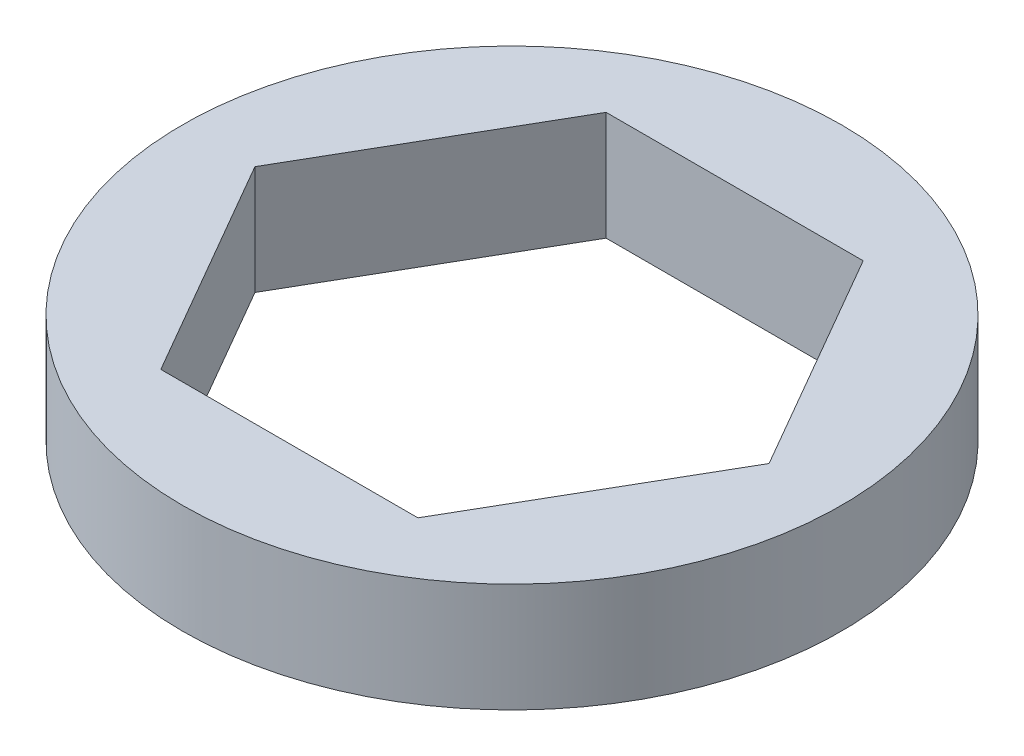
ISO-10303-21;
HEADER;
FILE_DESCRIPTION(('STEP AP214'),'2;1');
FILE_NAME('part.step','',(''),(''),'','','');
FILE_SCHEMA(('AUTOMOTIVE_DESIGN { 1 0 10303 214 1 1 1 1 }'));
ENDSEC;
DATA;
#1=APPLICATION_CONTEXT('core data for automotive mechanical design processes');
#2=APPLICATION_PROTOCOL_DEFINITION('international standard','automotive_design',2000,#1);
#3=PRODUCT_CONTEXT('',#1,'mechanical');
#4=PRODUCT('Part','Part','',(#3));
#5=PRODUCT_RELATED_PRODUCT_CATEGORY('part','',(#4));
#6=PRODUCT_DEFINITION_FORMATION('','',#4);
#7=PRODUCT_DEFINITION_CONTEXT('part definition',#1,'design');
#8=PRODUCT_DEFINITION('design','',#6,#7);
#9=PRODUCT_DEFINITION_SHAPE('','',#8);
#10=(LENGTH_UNIT() NAMED_UNIT(*) SI_UNIT(.MILLI.,.METRE.));
#11=(NAMED_UNIT(*) PLANE_ANGLE_UNIT() SI_UNIT($,.RADIAN.));
#12=(NAMED_UNIT(*) SI_UNIT($,.STERADIAN.) SOLID_ANGLE_UNIT());
#13=UNCERTAINTY_MEASURE_WITH_UNIT(LENGTH_MEASURE(1.E-05),#10,'distance_accuracy_value','');
#14=(GEOMETRIC_REPRESENTATION_CONTEXT(3) GLOBAL_UNCERTAINTY_ASSIGNED_CONTEXT((#13)) GLOBAL_UNIT_ASSIGNED_CONTEXT((#10,
#11,#12)) REPRESENTATION_CONTEXT('',''));
#15=CARTESIAN_POINT('',(0.,0.,0.));
#16=DIRECTION('',(0.,0.,1.));
#17=DIRECTION('',(1.,0.,0.));
#18=AXIS2_PLACEMENT_3D('',#15,#16,#17);
#19=CARTESIAN_POINT('',(0.,1.1811,0.));
#20=DIRECTION('',(0.,1.,0.));
#21=DIRECTION('',(0.,0.,1.));
#22=AXIS2_PLACEMENT_3D('',#19,#20,#21);
#23=PLANE('',#22);
#24=CARTESIAN_POINT('',(0.,1.1811,0.));
#25=DIRECTION('',(0.,1.,0.));
#26=DIRECTION('',(0.,0.,1.));
#27=AXIS2_PLACEMENT_3D('',#24,#25,#26);
#28=CIRCLE('',#27,7.14375);
#29=CARTESIAN_POINT('',(0.,1.1811,7.14375));
#30=VERTEX_POINT('',#29);
#31=EDGE_CURVE('E11',#30,#30,#28,.T.);
#32=ORIENTED_EDGE('',*,*,#31,.T.);
#33=EDGE_LOOP('',(#32));
#34=FACE_BOUND('',#33,.T.);
#35=DIRECTION('',(0.5,0.,-0.866025403784439));
#36=VECTOR('',#35,1.);
#37=CARTESIAN_POINT('',(2.78629239910914,1.1811,4.826));
#38=LINE('',#37,#36);
#39=CARTESIAN_POINT('',(2.78629239910914,1.1811,4.826));
#40=VERTEX_POINT('',#39);
#41=CARTESIAN_POINT('',(5.57258479821827,1.1811,0.));
#42=VERTEX_POINT('',#41);
#43=EDGE_CURVE('E95',#40,#42,#38,.T.);
#44=ORIENTED_EDGE('',*,*,#43,.F.);
#45=DIRECTION('',(1.,0.,0.));
#46=VECTOR('',#45,1.);
#47=CARTESIAN_POINT('',(-2.78629239910913,1.1811,4.826));
#48=LINE('',#47,#46);
#49=CARTESIAN_POINT('',(-2.78629239910913,1.1811,4.826));
#50=VERTEX_POINT('',#49);
#51=EDGE_CURVE('E87',#50,#40,#48,.T.);
#52=ORIENTED_EDGE('',*,*,#51,.F.);
#53=DIRECTION('',(0.5,0.,0.866025403784439));
#54=VECTOR('',#53,1.);
#55=CARTESIAN_POINT('',(-5.57258479821827,1.1811,0.));
#56=LINE('',#55,#54);
#57=CARTESIAN_POINT('',(-5.57258479821827,1.1811,0.));
#58=VERTEX_POINT('',#57);
#59=EDGE_CURVE('E115',#58,#50,#56,.T.);
#60=ORIENTED_EDGE('',*,*,#59,.F.);
#61=DIRECTION('',(-0.5,0.,0.866025403784438));
#62=VECTOR('',#61,1.);
#63=CARTESIAN_POINT('',(-2.78629239910913,1.1811,-4.826));
#64=LINE('',#63,#62);
#65=CARTESIAN_POINT('',(-2.78629239910913,1.1811,-4.826));
#66=VERTEX_POINT('',#65);
#67=EDGE_CURVE('E113',#66,#58,#64,.T.);
#68=ORIENTED_EDGE('',*,*,#67,.F.);
#69=DIRECTION('',(-1.,0.,0.));
#70=VECTOR('',#69,1.);
#71=CARTESIAN_POINT('',(2.78629239910914,1.1811,-4.826));
#72=LINE('',#71,#70);
#73=CARTESIAN_POINT('',(2.78629239910914,1.1811,-4.826));
#74=VERTEX_POINT('',#73);
#75=EDGE_CURVE('E109',#74,#66,#72,.T.);
#76=ORIENTED_EDGE('',*,*,#75,.F.);
#77=DIRECTION('',(-0.5,0.,-0.866025403784439));
#78=VECTOR('',#77,1.);
#79=CARTESIAN_POINT('',(5.57258479821827,1.1811,0.));
#80=LINE('',#79,#78);
#81=EDGE_CURVE('E107',#42,#74,#80,.T.);
#82=ORIENTED_EDGE('',*,*,#81,.F.);
#83=EDGE_LOOP('',(#44,#52,#60,#68,#76,#82));
#84=FACE_BOUND('',#83,.T.);
#85=ADVANCED_FACE('F34',(#34,#84),#23,.T.);
#86=CARTESIAN_POINT('',(0.,-1.1811,0.));
#87=DIRECTION('',(0.,1.,0.));
#88=DIRECTION('',(0.,0.,1.));
#89=AXIS2_PLACEMENT_3D('',#86,#87,#88);
#90=PLANE('',#89);
#91=CARTESIAN_POINT('',(0.,-1.1811,0.));
#92=DIRECTION('',(0.,1.,0.));
#93=DIRECTION('',(0.,0.,1.));
#94=AXIS2_PLACEMENT_3D('',#91,#92,#93);
#95=CIRCLE('',#94,7.14375);
#96=CARTESIAN_POINT('',(0.,-1.1811,7.14375));
#97=VERTEX_POINT('',#96);
#98=EDGE_CURVE('E38',#97,#97,#95,.T.);
#99=ORIENTED_EDGE('',*,*,#98,.F.);
#100=EDGE_LOOP('',(#99));
#101=FACE_BOUND('',#100,.T.);
#102=DIRECTION('',(1.,0.,0.));
#103=VECTOR('',#102,1.);
#104=CARTESIAN_POINT('',(-2.78629239910913,-1.1811,4.826));
#105=LINE('',#104,#103);
#106=CARTESIAN_POINT('',(-2.78629239910913,-1.1811,4.826));
#107=VERTEX_POINT('',#106);
#108=CARTESIAN_POINT('',(2.78629239910914,-1.1811,4.826));
#109=VERTEX_POINT('',#108);
#110=EDGE_CURVE('E57',#107,#109,#105,.T.);
#111=ORIENTED_EDGE('',*,*,#110,.T.);
#112=DIRECTION('',(0.5,0.,-0.866025403784439));
#113=VECTOR('',#112,1.);
#114=CARTESIAN_POINT('',(2.78629239910914,-1.1811,4.826));
#115=LINE('',#114,#113);
#116=CARTESIAN_POINT('',(5.57258479821827,-1.1811,0.));
#117=VERTEX_POINT('',#116);
#118=EDGE_CURVE('E102',#109,#117,#115,.T.);
#119=ORIENTED_EDGE('',*,*,#118,.T.);
#120=DIRECTION('',(-0.5,0.,-0.866025403784439));
#121=VECTOR('',#120,1.);
#122=CARTESIAN_POINT('',(5.57258479821827,-1.1811,0.));
#123=LINE('',#122,#121);
#124=CARTESIAN_POINT('',(2.78629239910914,-1.1811,-4.826));
#125=VERTEX_POINT('',#124);
#126=EDGE_CURVE('E119',#117,#125,#123,.T.);
#127=ORIENTED_EDGE('',*,*,#126,.T.);
#128=DIRECTION('',(-1.,0.,0.));
#129=VECTOR('',#128,1.);
#130=CARTESIAN_POINT('',(2.78629239910914,-1.1811,-4.826));
#131=LINE('',#130,#129);
#132=CARTESIAN_POINT('',(-2.78629239910913,-1.1811,-4.826));
#133=VERTEX_POINT('',#132);
#134=EDGE_CURVE('E122',#125,#133,#131,.T.);
#135=ORIENTED_EDGE('',*,*,#134,.T.);
#136=DIRECTION('',(-0.5,0.,0.866025403784438));
#137=VECTOR('',#136,1.);
#138=CARTESIAN_POINT('',(-2.78629239910913,-1.1811,-4.826));
#139=LINE('',#138,#137);
#140=CARTESIAN_POINT('',(-5.57258479821827,-1.1811,0.));
#141=VERTEX_POINT('',#140);
#142=EDGE_CURVE('E125',#133,#141,#139,.T.);
#143=ORIENTED_EDGE('',*,*,#142,.T.);
#144=DIRECTION('',(0.5,0.,0.866025403784439));
#145=VECTOR('',#144,1.);
#146=CARTESIAN_POINT('',(-5.57258479821827,-1.1811,0.));
#147=LINE('',#146,#145);
#148=EDGE_CURVE('E96',#141,#107,#147,.T.);
#149=ORIENTED_EDGE('',*,*,#148,.T.);
#150=EDGE_LOOP('',(#111,#119,#127,#135,#143,#149));
#151=FACE_BOUND('',#150,.T.);
#152=ADVANCED_FACE('F142',(#101,#151),#90,.F.);
#153=CARTESIAN_POINT('',(0.,1.1811,0.));
#154=DIRECTION('',(0.,-1.,0.));
#155=DIRECTION('',(0.,0.,-1.));
#156=AXIS2_PLACEMENT_3D('',#153,#154,#155);
#157=CYLINDRICAL_SURFACE('',#156,7.14375);
#158=ORIENTED_EDGE('',*,*,#31,.F.);
#159=EDGE_LOOP('',(#158));
#160=FACE_BOUND('',#159,.T.);
#161=ORIENTED_EDGE('',*,*,#98,.T.);
#162=EDGE_LOOP('',(#161));
#163=FACE_BOUND('',#162,.T.);
#164=ADVANCED_FACE('F36',(#160,#163),#157,.T.);
#165=CARTESIAN_POINT('',(-2.78629239910913,1.1811,4.826));
#166=DIRECTION('',(0.,0.,-1.));
#167=DIRECTION('',(-1.,0.,0.));
#168=AXIS2_PLACEMENT_3D('',#165,#166,#167);
#169=PLANE('',#168);
#170=ORIENTED_EDGE('',*,*,#110,.F.);
#171=DIRECTION('',(0.,-1.,0.));
#172=VECTOR('',#171,1.);
#173=CARTESIAN_POINT('',(-2.78629239910913,1.1811,4.826));
#174=LINE('',#173,#172);
#175=EDGE_CURVE('E91',#50,#107,#174,.T.);
#176=ORIENTED_EDGE('',*,*,#175,.F.);
#177=ORIENTED_EDGE('',*,*,#51,.T.);
#178=DIRECTION('',(0.,-1.,0.));
#179=VECTOR('',#178,1.);
#180=CARTESIAN_POINT('',(2.78629239910914,1.1811,4.826));
#181=LINE('',#180,#179);
#182=EDGE_CURVE('E90',#40,#109,#181,.T.);
#183=ORIENTED_EDGE('',*,*,#182,.T.);
#184=EDGE_LOOP('',(#170,#176,#177,#183));
#185=FACE_BOUND('',#184,.T.);
#186=ADVANCED_FACE('F89',(#185),#169,.T.);
#187=CARTESIAN_POINT('',(2.78629239910914,1.1811,4.826));
#188=DIRECTION('',(-0.866025403784439,0.,-0.5));
#189=DIRECTION('',(-0.5,0.,0.866025403784439));
#190=AXIS2_PLACEMENT_3D('',#187,#188,#189);
#191=PLANE('',#190);
#192=ORIENTED_EDGE('',*,*,#118,.F.);
#193=ORIENTED_EDGE('',*,*,#182,.F.);
#194=ORIENTED_EDGE('',*,*,#43,.T.);
#195=DIRECTION('',(0.,-1.,0.));
#196=VECTOR('',#195,1.);
#197=CARTESIAN_POINT('',(5.57258479821827,1.1811,0.));
#198=LINE('',#197,#196);
#199=EDGE_CURVE('E103',#42,#117,#198,.T.);
#200=ORIENTED_EDGE('',*,*,#199,.T.);
#201=EDGE_LOOP('',(#192,#193,#194,#200));
#202=FACE_BOUND('',#201,.T.);
#203=ADVANCED_FACE('F99',(#202),#191,.T.);
#204=CARTESIAN_POINT('',(5.57258479821827,1.1811,0.));
#205=DIRECTION('',(-0.866025403784439,0.,0.5));
#206=DIRECTION('',(0.5,0.,0.866025403784439));
#207=AXIS2_PLACEMENT_3D('',#204,#205,#206);
#208=PLANE('',#207);
#209=ORIENTED_EDGE('',*,*,#126,.F.);
#210=ORIENTED_EDGE('',*,*,#199,.F.);
#211=ORIENTED_EDGE('',*,*,#81,.T.);
#212=DIRECTION('',(0.,-1.,0.));
#213=VECTOR('',#212,1.);
#214=CARTESIAN_POINT('',(2.78629239910914,1.1811,-4.826));
#215=LINE('',#214,#213);
#216=EDGE_CURVE('E134',#74,#125,#215,.T.);
#217=ORIENTED_EDGE('',*,*,#216,.T.);
#218=EDGE_LOOP('',(#209,#210,#211,#217));
#219=FACE_BOUND('',#218,.T.);
#220=ADVANCED_FACE('F138',(#219),#208,.T.);
#221=CARTESIAN_POINT('',(2.78629239910914,1.1811,-4.826));
#222=DIRECTION('',(0.,0.,1.));
#223=DIRECTION('',(1.,0.,0.));
#224=AXIS2_PLACEMENT_3D('',#221,#222,#223);
#225=PLANE('',#224);
#226=ORIENTED_EDGE('',*,*,#134,.F.);
#227=ORIENTED_EDGE('',*,*,#216,.F.);
#228=ORIENTED_EDGE('',*,*,#75,.T.);
#229=DIRECTION('',(0.,-1.,0.));
#230=VECTOR('',#229,1.);
#231=CARTESIAN_POINT('',(-2.78629239910913,1.1811,-4.826));
#232=LINE('',#231,#230);
#233=EDGE_CURVE('E132',#66,#133,#232,.T.);
#234=ORIENTED_EDGE('',*,*,#233,.T.);
#235=EDGE_LOOP('',(#226,#227,#228,#234));
#236=FACE_BOUND('',#235,.T.);
#237=ADVANCED_FACE('F150',(#236),#225,.T.);
#238=CARTESIAN_POINT('',(-2.78629239910913,1.1811,-4.826));
#239=DIRECTION('',(0.866025403784439,0.,0.5));
#240=DIRECTION('',(0.5,0.,-0.866025403784439));
#241=AXIS2_PLACEMENT_3D('',#238,#239,#240);
#242=PLANE('',#241);
#243=ORIENTED_EDGE('',*,*,#142,.F.);
#244=ORIENTED_EDGE('',*,*,#233,.F.);
#245=ORIENTED_EDGE('',*,*,#67,.T.);
#246=DIRECTION('',(0.,-1.,0.));
#247=VECTOR('',#246,1.);
#248=CARTESIAN_POINT('',(-5.57258479821827,1.1811,0.));
#249=LINE('',#248,#247);
#250=EDGE_CURVE('E49',#58,#141,#249,.T.);
#251=ORIENTED_EDGE('',*,*,#250,.T.);
#252=EDGE_LOOP('',(#243,#244,#245,#251));
#253=FACE_BOUND('',#252,.T.);
#254=ADVANCED_FACE('F148',(#253),#242,.T.);
#255=CARTESIAN_POINT('',(-5.57258479821827,1.1811,0.));
#256=DIRECTION('',(0.866025403784439,0.,-0.5));
#257=DIRECTION('',(-0.5,0.,-0.866025403784439));
#258=AXIS2_PLACEMENT_3D('',#255,#256,#257);
#259=PLANE('',#258);
#260=ORIENTED_EDGE('',*,*,#148,.F.);
#261=ORIENTED_EDGE('',*,*,#250,.F.);
#262=ORIENTED_EDGE('',*,*,#59,.T.);
#263=ORIENTED_EDGE('',*,*,#175,.T.);
#264=EDGE_LOOP('',(#260,#261,#262,#263));
#265=FACE_BOUND('',#264,.T.);
#266=ADVANCED_FACE('F144',(#265),#259,.T.);
#267=CLOSED_SHELL('',(#85,#152,#164,#186,#203,#220,#237,#254,#266));
#268=MANIFOLD_SOLID_BREP('B2',#267);
#269=ADVANCED_BREP_SHAPE_REPRESENTATION('',(#18,#268),#14);
#270=SHAPE_DEFINITION_REPRESENTATION(#9,#269);
ENDSEC;
END-ISO-10303-21;
